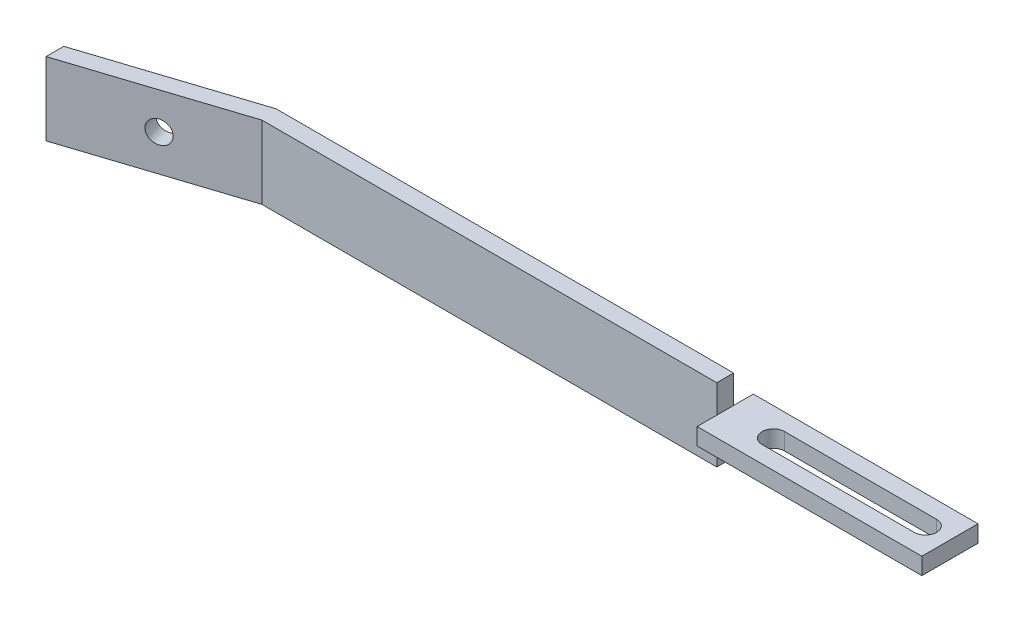
ISO-10303-21;
HEADER;
FILE_DESCRIPTION(('STEP AP214'),'2;1');
FILE_NAME('part.step','',(''),(''),'','','');
FILE_SCHEMA(('AUTOMOTIVE_DESIGN { 1 0 10303 214 1 1 1 1 }'));
ENDSEC;
DATA;
#1=APPLICATION_CONTEXT('core data for automotive mechanical design processes');
#2=APPLICATION_PROTOCOL_DEFINITION('international standard','automotive_design',2000,#1);
#3=PRODUCT_CONTEXT('',#1,'mechanical');
#4=PRODUCT('Part','Part','',(#3));
#5=PRODUCT_RELATED_PRODUCT_CATEGORY('part','',(#4));
#6=PRODUCT_DEFINITION_FORMATION('','',#4);
#7=PRODUCT_DEFINITION_CONTEXT('part definition',#1,'design');
#8=PRODUCT_DEFINITION('design','',#6,#7);
#9=PRODUCT_DEFINITION_SHAPE('','',#8);
#10=(LENGTH_UNIT() NAMED_UNIT(*) SI_UNIT(.MILLI.,.METRE.));
#11=(NAMED_UNIT(*) PLANE_ANGLE_UNIT() SI_UNIT($,.RADIAN.));
#12=(NAMED_UNIT(*) SI_UNIT($,.STERADIAN.) SOLID_ANGLE_UNIT());
#13=UNCERTAINTY_MEASURE_WITH_UNIT(LENGTH_MEASURE(1.E-05),#10,'distance_accuracy_value','');
#14=(GEOMETRIC_REPRESENTATION_CONTEXT(3) GLOBAL_UNCERTAINTY_ASSIGNED_CONTEXT((#13)) GLOBAL_UNIT_ASSIGNED_CONTEXT((#10,
#11,#12)) REPRESENTATION_CONTEXT('',''));
#15=CARTESIAN_POINT('',(0.,0.,0.));
#16=DIRECTION('',(0.,0.,1.));
#17=DIRECTION('',(1.,0.,0.));
#18=AXIS2_PLACEMENT_3D('',#15,#16,#17);
#19=CARTESIAN_POINT('',(0.,0.,0.));
#20=DIRECTION('',(0.,0.,1.));
#21=DIRECTION('',(1.,0.,0.));
#22=AXIS2_PLACEMENT_3D('',#19,#20,#21);
#23=PLANE('',#22);
#24=DIRECTION('',(0.,1.,0.));
#25=VECTOR('',#24,1.);
#26=CARTESIAN_POINT('',(34.9999999999998,-1.49999999999999,0.));
#27=LINE('',#26,#25);
#28=CARTESIAN_POINT('',(34.9999999999998,-1.49999999999999,0.));
#29=VERTEX_POINT('',#28);
#30=CARTESIAN_POINT('',(34.9999999999998,1.5,0.));
#31=VERTEX_POINT('',#30);
#32=EDGE_CURVE('E190',#29,#31,#27,.T.);
#33=ORIENTED_EDGE('',*,*,#32,.F.);
#34=DIRECTION('',(0.,-1.,0.));
#35=VECTOR('',#34,1.);
#36=CARTESIAN_POINT('',(34.9999999999998,-1.49999999999999,0.));
#37=LINE('',#36,#35);
#38=CARTESIAN_POINT('',(34.9999999999998,-6.49999999999999,0.));
#39=VERTEX_POINT('',#38);
#40=EDGE_CURVE('E212',#29,#39,#37,.T.);
#41=ORIENTED_EDGE('',*,*,#40,.T.);
#42=DIRECTION('',(1.,0.,0.));
#43=VECTOR('',#42,1.);
#44=CARTESIAN_POINT('',(-75.0000000000002,-6.49999999999999,0.));
#45=LINE('',#44,#43);
#46=CARTESIAN_POINT('',(-46.4683045111456,-6.49999999999999,0.));
#47=VERTEX_POINT('',#46);
#48=EDGE_CURVE('E278',#47,#39,#45,.T.);
#49=ORIENTED_EDGE('',*,*,#48,.F.);
#50=DIRECTION('',(0.,1.,0.));
#51=VECTOR('',#50,1.);
#52=CARTESIAN_POINT('',(-46.4683045111456,0.,0.));
#53=LINE('',#52,#51);
#54=CARTESIAN_POINT('',(-46.4683045111456,6.50000000000001,0.));
#55=VERTEX_POINT('',#54);
#56=EDGE_CURVE('E285',#47,#55,#53,.T.);
#57=ORIENTED_EDGE('',*,*,#56,.T.);
#58=DIRECTION('',(-1.,0.,0.));
#59=VECTOR('',#58,1.);
#60=CARTESIAN_POINT('',(-75.0000000000002,6.50000000000001,0.));
#61=LINE('',#60,#59);
#62=CARTESIAN_POINT('',(34.9999999999998,6.50000000000001,0.));
#63=VERTEX_POINT('',#62);
#64=EDGE_CURVE('E276',#63,#55,#61,.T.);
#65=ORIENTED_EDGE('',*,*,#64,.F.);
#66=DIRECTION('',(0.,-1.,0.));
#67=VECTOR('',#66,1.);
#68=CARTESIAN_POINT('',(34.9999999999998,1.5,0.));
#69=LINE('',#68,#67);
#70=EDGE_CURVE('E211',#63,#31,#69,.T.);
#71=ORIENTED_EDGE('',*,*,#70,.T.);
#72=EDGE_LOOP('',(#33,#41,#49,#57,#65,#71));
#73=FACE_BOUND('',#72,.T.);
#74=ADVANCED_FACE('F50',(#73),#23,.F.);
#75=CARTESIAN_POINT('',(74.9999999999998,6.50000000000001,3.));
#76=DIRECTION('',(0.,0.,-1.));
#77=DIRECTION('',(-1.,0.,0.));
#78=AXIS2_PLACEMENT_3D('',#75,#76,#77);
#79=PLANE('',#78);
#80=DIRECTION('',(1.,0.,0.));
#81=VECTOR('',#80,1.);
#82=CARTESIAN_POINT('',(74.9999999999998,-6.49999999999999,3.));
#83=LINE('',#82,#81);
#84=CARTESIAN_POINT('',(-45.993151190172,-6.49999999999999,2.99999999999999));
#85=VERTEX_POINT('',#84);
#86=CARTESIAN_POINT('',(34.9999999999998,-6.49999999999999,3.));
#87=VERTEX_POINT('',#86);
#88=EDGE_CURVE('E256',#85,#87,#83,.T.);
#89=ORIENTED_EDGE('',*,*,#88,.T.);
#90=DIRECTION('',(0.,1.,0.));
#91=VECTOR('',#90,1.);
#92=CARTESIAN_POINT('',(34.9999999999999,6.50000000000018,2.99999999999999));
#93=LINE('',#92,#91);
#94=CARTESIAN_POINT('',(34.9999999999998,-1.49999999999999,3.));
#95=VERTEX_POINT('',#94);
#96=EDGE_CURVE('E220',#87,#95,#93,.T.);
#97=ORIENTED_EDGE('',*,*,#96,.T.);
#98=DIRECTION('',(0.,-1.,0.));
#99=VECTOR('',#98,1.);
#100=CARTESIAN_POINT('',(34.9999999999998,6.50000000000001,2.99999999999999));
#101=LINE('',#100,#99);
#102=CARTESIAN_POINT('',(34.9999999999998,1.5,2.99999999999999));
#103=VERTEX_POINT('',#102);
#104=EDGE_CURVE('E288',#103,#95,#101,.T.);
#105=ORIENTED_EDGE('',*,*,#104,.F.);
#106=DIRECTION('',(0.,1.,0.));
#107=VECTOR('',#106,1.);
#108=CARTESIAN_POINT('',(34.9999999999998,6.4999999999999,2.99999999999999));
#109=LINE('',#108,#107);
#110=CARTESIAN_POINT('',(34.9999999999998,6.50000000000001,3.));
#111=VERTEX_POINT('',#110);
#112=EDGE_CURVE('E229',#103,#111,#109,.T.);
#113=ORIENTED_EDGE('',*,*,#112,.T.);
#114=DIRECTION('',(1.,0.,0.));
#115=VECTOR('',#114,1.);
#116=CARTESIAN_POINT('',(74.9999999999998,6.50000000000001,3.));
#117=LINE('',#116,#115);
#118=CARTESIAN_POINT('',(-45.993151190172,6.50000000000001,2.99999999999999));
#119=VERTEX_POINT('',#118);
#120=EDGE_CURVE('E255',#119,#111,#117,.T.);
#121=ORIENTED_EDGE('',*,*,#120,.F.);
#122=DIRECTION('',(0.,-1.,0.));
#123=VECTOR('',#122,1.);
#124=CARTESIAN_POINT('',(-45.993151190172,6.50000000000001,2.99999999999999));
#125=LINE('',#124,#123);
#126=EDGE_CURVE('E264',#119,#85,#125,.T.);
#127=ORIENTED_EDGE('',*,*,#126,.T.);
#128=EDGE_LOOP('',(#89,#97,#105,#113,#121,#127));
#129=FACE_BOUND('',#128,.T.);
#130=ADVANCED_FACE('F315',(#129),#79,.F.);
#131=CARTESIAN_POINT('',(74.9999999999998,6.50000000000001,40.));
#132=DIRECTION('',(-1.,0.,0.));
#133=DIRECTION('',(0.,-1.,0.));
#134=AXIS2_PLACEMENT_3D('',#131,#132,#133);
#135=PLANE('',#134);
#136=DIRECTION('',(0.,0.,-1.));
#137=VECTOR('',#136,1.);
#138=CARTESIAN_POINT('',(74.9999999999998,-1.49999999999999,6.5));
#139=LINE('',#138,#137);
#140=CARTESIAN_POINT('',(74.9999999999998,-1.49999999999999,6.5));
#141=VERTEX_POINT('',#140);
#142=CARTESIAN_POINT('',(74.9999999999998,-1.49999999999999,-3.5));
#143=VERTEX_POINT('',#142);
#144=EDGE_CURVE('E241',#141,#143,#139,.T.);
#145=ORIENTED_EDGE('',*,*,#144,.T.);
#146=DIRECTION('',(0.,-1.,0.));
#147=VECTOR('',#146,1.);
#148=CARTESIAN_POINT('',(74.9999999999998,-1.49999999999999,-3.5));
#149=LINE('',#148,#147);
#150=CARTESIAN_POINT('',(74.9999999999998,1.5,-3.5));
#151=VERTEX_POINT('',#150);
#152=EDGE_CURVE('E193',#151,#143,#149,.T.);
#153=ORIENTED_EDGE('',*,*,#152,.F.);
#154=DIRECTION('',(0.,0.,-1.));
#155=VECTOR('',#154,1.);
#156=CARTESIAN_POINT('',(74.9999999999998,1.50000000000001,6.5));
#157=LINE('',#156,#155);
#158=CARTESIAN_POINT('',(74.9999999999998,1.50000000000001,6.5));
#159=VERTEX_POINT('',#158);
#160=EDGE_CURVE('E249',#159,#151,#157,.T.);
#161=ORIENTED_EDGE('',*,*,#160,.F.);
#162=DIRECTION('',(0.,1.,0.));
#163=VECTOR('',#162,1.);
#164=CARTESIAN_POINT('',(74.9999999999998,1.50000000000001,6.5));
#165=LINE('',#164,#163);
#166=EDGE_CURVE('E232',#141,#159,#165,.T.);
#167=ORIENTED_EDGE('',*,*,#166,.F.);
#168=EDGE_LOOP('',(#145,#153,#161,#167));
#169=FACE_BOUND('',#168,.T.);
#170=ADVANCED_FACE('F52',(#169),#135,.F.);
#171=CARTESIAN_POINT('',(-75.0000000000002,6.50000000000001,40.));
#172=DIRECTION('',(0.,-1.,0.));
#173=DIRECTION('',(0.,0.,-1.));
#174=AXIS2_PLACEMENT_3D('',#171,#172,#173);
#175=PLANE('',#174);
#176=ORIENTED_EDGE('',*,*,#120,.T.);
#177=DIRECTION('',(0.,0.,1.));
#178=VECTOR('',#177,1.);
#179=CARTESIAN_POINT('',(34.9999999999998,6.50000000000001,0.));
#180=LINE('',#179,#178);
#181=EDGE_CURVE('E223',#63,#111,#180,.T.);
#182=ORIENTED_EDGE('',*,*,#181,.F.);
#183=ORIENTED_EDGE('',*,*,#64,.T.);
#184=DIRECTION('',(-0.951056516295153,0.,0.309016994374949));
#185=VECTOR('',#184,1.);
#186=CARTESIAN_POINT('',(-84.0311705658295,6.50000000000001,12.2049150281253));
#187=LINE('',#186,#185);
#188=CARTESIAN_POINT('',(-75.0000000000002,6.50000000000001,9.27050983124846));
#189=VERTEX_POINT('',#188);
#190=EDGE_CURVE('E273',#55,#189,#187,.T.);
#191=ORIENTED_EDGE('',*,*,#190,.T.);
#192=DIRECTION('',(0.,0.,-1.));
#193=VECTOR('',#192,1.);
#194=CARTESIAN_POINT('',(-75.0000000000002,6.50000000000001,40.));
#195=LINE('',#194,#193);
#196=CARTESIAN_POINT('',(-75.0000000000002,6.50000000000001,12.4248965039633));
#197=VERTEX_POINT('',#196);
#198=EDGE_CURVE('E283',#197,#189,#195,.T.);
#199=ORIENTED_EDGE('',*,*,#198,.F.);
#200=DIRECTION('',(0.951056516295153,0.,-0.309016994374949));
#201=VECTOR('',#200,1.);
#202=CARTESIAN_POINT('',(-75.0000000000002,6.50000000000001,12.4248965039633));
#203=LINE('',#202,#201);
#204=EDGE_CURVE('E252',#197,#119,#203,.T.);
#205=ORIENTED_EDGE('',*,*,#204,.T.);
#206=EDGE_LOOP('',(#176,#182,#183,#191,#199,#205));
#207=FACE_BOUND('',#206,.T.);
#208=ADVANCED_FACE('F333',(#207),#175,.F.);
#209=CARTESIAN_POINT('',(-75.0000000000002,6.50000000000001,40.));
#210=DIRECTION('',(1.,0.,0.));
#211=DIRECTION('',(0.,1.,0.));
#212=AXIS2_PLACEMENT_3D('',#209,#210,#211);
#213=PLANE('',#212);
#214=DIRECTION('',(0.,0.,-1.));
#215=VECTOR('',#214,1.);
#216=CARTESIAN_POINT('',(-75.0000000000002,-6.49999999999999,40.));
#217=LINE('',#216,#215);
#218=CARTESIAN_POINT('',(-75.0000000000002,-6.49999999999999,12.4248965039633));
#219=VERTEX_POINT('',#218);
#220=CARTESIAN_POINT('',(-75.0000000000002,-6.49999999999999,9.27050983124846));
#221=VERTEX_POINT('',#220);
#222=EDGE_CURVE('E281',#219,#221,#217,.T.);
#223=ORIENTED_EDGE('',*,*,#222,.F.);
#224=DIRECTION('',(0.,-1.,0.));
#225=VECTOR('',#224,1.);
#226=CARTESIAN_POINT('',(-75.0000000000002,6.50000000000001,12.4248965039633));
#227=LINE('',#226,#225);
#228=EDGE_CURVE('E259',#197,#219,#227,.T.);
#229=ORIENTED_EDGE('',*,*,#228,.F.);
#230=ORIENTED_EDGE('',*,*,#198,.T.);
#231=DIRECTION('',(0.,-1.,0.));
#232=VECTOR('',#231,1.);
#233=CARTESIAN_POINT('',(-75.0000000000002,33.5,9.27050983124846));
#234=LINE('',#233,#232);
#235=EDGE_CURVE('E270',#189,#221,#234,.T.);
#236=ORIENTED_EDGE('',*,*,#235,.T.);
#237=EDGE_LOOP('',(#223,#229,#230,#236));
#238=FACE_BOUND('',#237,.T.);
#239=ADVANCED_FACE('F330',(#238),#213,.F.);
#240=CARTESIAN_POINT('',(-75.0000000000002,-6.49999999999999,40.));
#241=DIRECTION('',(0.,1.,0.));
#242=DIRECTION('',(0.,0.,1.));
#243=AXIS2_PLACEMENT_3D('',#240,#241,#242);
#244=PLANE('',#243);
#245=ORIENTED_EDGE('',*,*,#48,.T.);
#246=DIRECTION('',(0.,0.,1.));
#247=VECTOR('',#246,1.);
#248=CARTESIAN_POINT('',(34.9999999999998,-6.49999999999999,0.));
#249=LINE('',#248,#247);
#250=EDGE_CURVE('E217',#39,#87,#249,.T.);
#251=ORIENTED_EDGE('',*,*,#250,.T.);
#252=ORIENTED_EDGE('',*,*,#88,.F.);
#253=DIRECTION('',(0.951056516295153,0.,-0.309016994374949));
#254=VECTOR('',#253,1.);
#255=CARTESIAN_POINT('',(-75.0000000000002,-6.49999999999999,12.4248965039633));
#256=LINE('',#255,#254);
#257=EDGE_CURVE('E251',#219,#85,#256,.T.);
#258=ORIENTED_EDGE('',*,*,#257,.F.);
#259=ORIENTED_EDGE('',*,*,#222,.T.);
#260=DIRECTION('',(-0.951056516295153,0.,0.309016994374949));
#261=VECTOR('',#260,1.);
#262=CARTESIAN_POINT('',(-75.0000000000002,-6.49999999999999,9.27050983124846));
#263=LINE('',#262,#261);
#264=EDGE_CURVE('E266',#47,#221,#263,.T.);
#265=ORIENTED_EDGE('',*,*,#264,.F.);
#266=EDGE_LOOP('',(#245,#251,#252,#258,#259,#265));
#267=FACE_BOUND('',#266,.T.);
#268=ADVANCED_FACE('F327',(#267),#244,.F.);
#269=CARTESIAN_POINT('',(-75.0000000000002,33.5,9.27050983124846));
#270=DIRECTION('',(0.309016994374949,0.,0.951056516295153));
#271=DIRECTION('',(0.951056516295153,0.,-0.309016994374949));
#272=AXIS2_PLACEMENT_3D('',#269,#270,#271);
#273=PLANE('',#272);
#274=CARTESIAN_POINT('',(-60.7341522555729,0.,4.63525491562423));
#275=DIRECTION('',(-0.309016994374949,0.,-0.951056516295153));
#276=DIRECTION('',(-0.951056516295153,0.,0.309016994374949));
#277=AXIS2_PLACEMENT_3D('',#274,#275,#276);
#278=CIRCLE('',#277,1.99999999999999);
#279=CARTESIAN_POINT('',(-62.6362652881632,0.,5.25328890437412));
#280=VERTEX_POINT('',#279);
#281=EDGE_CURVE('E404',#280,#280,#278,.T.);
#282=ORIENTED_EDGE('',*,*,#281,.F.);
#283=EDGE_LOOP('',(#282));
#284=FACE_BOUND('',#283,.T.);
#285=ORIENTED_EDGE('',*,*,#56,.F.);
#286=ORIENTED_EDGE('',*,*,#264,.T.);
#287=ORIENTED_EDGE('',*,*,#235,.F.);
#288=ORIENTED_EDGE('',*,*,#190,.F.);
#289=EDGE_LOOP('',(#285,#286,#287,#288));
#290=FACE_BOUND('',#289,.T.);
#291=ADVANCED_FACE('F325',(#284,#290),#273,.F.);
#292=CARTESIAN_POINT('',(-75.0000000000002,6.50000000000001,12.4248965039633));
#293=DIRECTION('',(-0.309016994374949,0.,-0.951056516295153));
#294=DIRECTION('',(-0.951056516295153,0.,0.309016994374949));
#295=AXIS2_PLACEMENT_3D('',#292,#293,#294);
#296=PLANE('',#295);
#297=CARTESIAN_POINT('',(-59.807101272448,0.,7.48842446450968));
#298=DIRECTION('',(-0.309016994374949,0.,-0.951056516295153));
#299=DIRECTION('',(-0.951056516295153,0.,0.309016994374949));
#300=AXIS2_PLACEMENT_3D('',#297,#298,#299);
#301=CIRCLE('',#300,1.99999999999999);
#302=CARTESIAN_POINT('',(-61.7092143050383,0.,8.10645845325958));
#303=VERTEX_POINT('',#302);
#304=EDGE_CURVE('E54',#303,#303,#301,.T.);
#305=ORIENTED_EDGE('',*,*,#304,.T.);
#306=EDGE_LOOP('',(#305));
#307=FACE_BOUND('',#306,.T.);
#308=ORIENTED_EDGE('',*,*,#257,.T.);
#309=ORIENTED_EDGE('',*,*,#126,.F.);
#310=ORIENTED_EDGE('',*,*,#204,.F.);
#311=ORIENTED_EDGE('',*,*,#228,.T.);
#312=EDGE_LOOP('',(#308,#309,#310,#311));
#313=FACE_BOUND('',#312,.T.);
#314=ADVANCED_FACE('F388',(#307,#313),#296,.F.);
#315=CARTESIAN_POINT('',(74.9999999999998,1.50000000000001,6.5));
#316=DIRECTION('',(0.,-1.,0.));
#317=DIRECTION('',(1.,0.,0.));
#318=AXIS2_PLACEMENT_3D('',#315,#316,#317);
#319=PLANE('',#318);
#320=DIRECTION('',(-1.,0.,0.));
#321=VECTOR('',#320,1.);
#322=CARTESIAN_POINT('',(70.6386916232802,1.50000000000001,-0.5));
#323=LINE('',#322,#321);
#324=CARTESIAN_POINT('',(70.6386916232802,1.50000000000001,-0.5));
#325=VERTEX_POINT('',#324);
#326=CARTESIAN_POINT('',(43.5615097736033,1.5,-0.499999999999997));
#327=VERTEX_POINT('',#326);
#328=EDGE_CURVE('E176',#325,#327,#323,.T.);
#329=ORIENTED_EDGE('',*,*,#328,.F.);
#330=CARTESIAN_POINT('',(70.6386916232802,1.50000000000001,1.5));
#331=DIRECTION('',(0.,1.,0.));
#332=DIRECTION('',(-1.,0.,0.));
#333=AXIS2_PLACEMENT_3D('',#330,#331,#332);
#334=CIRCLE('',#333,2.);
#335=CARTESIAN_POINT('',(70.6386916232802,1.50000000000001,3.5));
#336=VERTEX_POINT('',#335);
#337=EDGE_CURVE('E66',#336,#325,#334,.T.);
#338=ORIENTED_EDGE('',*,*,#337,.F.);
#339=DIRECTION('',(1.,0.,0.));
#340=VECTOR('',#339,1.);
#341=CARTESIAN_POINT('',(70.6386916232802,1.50000000000001,3.5));
#342=LINE('',#341,#340);
#343=CARTESIAN_POINT('',(43.5615097736033,1.5,3.5));
#344=VERTEX_POINT('',#343);
#345=EDGE_CURVE('E183',#344,#336,#342,.T.);
#346=ORIENTED_EDGE('',*,*,#345,.F.);
#347=CARTESIAN_POINT('',(43.5615097736033,1.5,1.5));
#348=DIRECTION('',(0.,1.,0.));
#349=DIRECTION('',(-1.,0.,0.));
#350=AXIS2_PLACEMENT_3D('',#347,#348,#349);
#351=CIRCLE('',#350,2.);
#352=EDGE_CURVE('E167',#327,#344,#351,.T.);
#353=ORIENTED_EDGE('',*,*,#352,.F.);
#354=EDGE_LOOP('',(#329,#338,#346,#353));
#355=FACE_BOUND('',#354,.T.);
#356=ORIENTED_EDGE('',*,*,#160,.T.);
#357=DIRECTION('',(1.,0.,0.));
#358=VECTOR('',#357,1.);
#359=CARTESIAN_POINT('',(74.9999999999998,1.5,-3.5));
#360=LINE('',#359,#358);
#361=CARTESIAN_POINT('',(34.9999999999998,1.5,-3.5));
#362=VERTEX_POINT('',#361);
#363=EDGE_CURVE('E200',#362,#151,#360,.T.);
#364=ORIENTED_EDGE('',*,*,#363,.F.);
#365=DIRECTION('',(0.,0.,1.));
#366=VECTOR('',#365,1.);
#367=CARTESIAN_POINT('',(34.9999999999998,1.5,-3.5));
#368=LINE('',#367,#366);
#369=EDGE_CURVE('E203',#362,#31,#368,.T.);
#370=ORIENTED_EDGE('',*,*,#369,.T.);
#371=DIRECTION('',(0.,0.,1.));
#372=VECTOR('',#371,1.);
#373=CARTESIAN_POINT('',(34.9999999999998,1.5,0.));
#374=LINE('',#373,#372);
#375=EDGE_CURVE('E216',#31,#103,#374,.T.);
#376=ORIENTED_EDGE('',*,*,#375,.T.);
#377=DIRECTION('',(0.,0.,-1.));
#378=VECTOR('',#377,1.);
#379=CARTESIAN_POINT('',(34.9999999999998,1.5,6.5));
#380=LINE('',#379,#378);
#381=CARTESIAN_POINT('',(34.9999999999998,1.5,6.5));
#382=VERTEX_POINT('',#381);
#383=EDGE_CURVE('E246',#382,#103,#380,.T.);
#384=ORIENTED_EDGE('',*,*,#383,.F.);
#385=DIRECTION('',(-1.,0.,0.));
#386=VECTOR('',#385,1.);
#387=CARTESIAN_POINT('',(74.9999999999998,1.50000000000001,6.5));
#388=LINE('',#387,#386);
#389=EDGE_CURVE('E235',#159,#382,#388,.T.);
#390=ORIENTED_EDGE('',*,*,#389,.F.);
#391=EDGE_LOOP('',(#356,#364,#370,#376,#384,#390));
#392=FACE_BOUND('',#391,.T.);
#393=ADVANCED_FACE('F180',(#355,#392),#319,.F.);
#394=CARTESIAN_POINT('',(34.9999999999998,1.5,6.5));
#395=DIRECTION('',(1.,0.,0.));
#396=DIRECTION('',(0.,0.,-1.));
#397=AXIS2_PLACEMENT_3D('',#394,#395,#396);
#398=PLANE('',#397);
#399=ORIENTED_EDGE('',*,*,#383,.T.);
#400=ORIENTED_EDGE('',*,*,#104,.T.);
#401=DIRECTION('',(0.,0.,-1.));
#402=VECTOR('',#401,1.);
#403=CARTESIAN_POINT('',(34.9999999999998,-1.5,6.5));
#404=LINE('',#403,#402);
#405=CARTESIAN_POINT('',(34.9999999999998,-1.5,6.5));
#406=VERTEX_POINT('',#405);
#407=EDGE_CURVE('E243',#406,#95,#404,.T.);
#408=ORIENTED_EDGE('',*,*,#407,.F.);
#409=DIRECTION('',(0.,-1.,0.));
#410=VECTOR('',#409,1.);
#411=CARTESIAN_POINT('',(34.9999999999998,1.5,6.5));
#412=LINE('',#411,#410);
#413=EDGE_CURVE('E237',#382,#406,#412,.T.);
#414=ORIENTED_EDGE('',*,*,#413,.F.);
#415=EDGE_LOOP('',(#399,#400,#408,#414));
#416=FACE_BOUND('',#415,.T.);
#417=ADVANCED_FACE('F368',(#416),#398,.F.);
#418=CARTESIAN_POINT('',(74.9999999999998,-1.49999999999999,6.5));
#419=DIRECTION('',(0.,1.,0.));
#420=DIRECTION('',(-1.,0.,0.));
#421=AXIS2_PLACEMENT_3D('',#418,#419,#420);
#422=PLANE('',#421);
#423=DIRECTION('',(1.,0.,0.));
#424=VECTOR('',#423,1.);
#425=CARTESIAN_POINT('',(74.9999999999998,-1.49999999999999,3.5));
#426=LINE('',#425,#424);
#427=CARTESIAN_POINT('',(43.5615097736033,-1.5,3.5));
#428=VERTEX_POINT('',#427);
#429=CARTESIAN_POINT('',(70.6386916232802,-1.49999999999999,3.5));
#430=VERTEX_POINT('',#429);
#431=EDGE_CURVE('E59',#428,#430,#426,.T.);
#432=ORIENTED_EDGE('',*,*,#431,.T.);
#433=CARTESIAN_POINT('',(70.6386916232802,-1.49999999999999,1.5));
#434=DIRECTION('',(0.,1.,0.));
#435=DIRECTION('',(-1.,0.,0.));
#436=AXIS2_PLACEMENT_3D('',#433,#434,#435);
#437=CIRCLE('',#436,2.);
#438=CARTESIAN_POINT('',(70.6386916232802,-1.49999999999999,-0.5));
#439=VERTEX_POINT('',#438);
#440=EDGE_CURVE('E13',#430,#439,#437,.T.);
#441=ORIENTED_EDGE('',*,*,#440,.T.);
#442=DIRECTION('',(-1.,0.,0.));
#443=VECTOR('',#442,1.);
#444=CARTESIAN_POINT('',(74.9999999999998,-1.49999999999999,-0.5));
#445=LINE('',#444,#443);
#446=CARTESIAN_POINT('',(43.5615097736033,-1.49999999999999,-0.499999999999997));
#447=VERTEX_POINT('',#446);
#448=EDGE_CURVE('E291',#439,#447,#445,.T.);
#449=ORIENTED_EDGE('',*,*,#448,.T.);
#450=CARTESIAN_POINT('',(43.5615097736033,-1.49999999999999,1.5));
#451=DIRECTION('',(0.,1.,0.));
#452=DIRECTION('',(-1.,0.,0.));
#453=AXIS2_PLACEMENT_3D('',#450,#451,#452);
#454=CIRCLE('',#453,2.);
#455=EDGE_CURVE('E170',#447,#428,#454,.T.);
#456=ORIENTED_EDGE('',*,*,#455,.T.);
#457=EDGE_LOOP('',(#432,#441,#449,#456));
#458=FACE_BOUND('',#457,.T.);
#459=ORIENTED_EDGE('',*,*,#407,.T.);
#460=DIRECTION('',(0.,0.,1.));
#461=VECTOR('',#460,1.);
#462=CARTESIAN_POINT('',(34.9999999999998,-1.49999999999999,0.));
#463=LINE('',#462,#461);
#464=EDGE_CURVE('E215',#29,#95,#463,.T.);
#465=ORIENTED_EDGE('',*,*,#464,.F.);
#466=DIRECTION('',(0.,0.,1.));
#467=VECTOR('',#466,1.);
#468=CARTESIAN_POINT('',(34.9999999999998,-1.49999999999999,-3.5));
#469=LINE('',#468,#467);
#470=CARTESIAN_POINT('',(34.9999999999998,-1.49999999999999,-3.5));
#471=VERTEX_POINT('',#470);
#472=EDGE_CURVE('E208',#471,#29,#469,.T.);
#473=ORIENTED_EDGE('',*,*,#472,.F.);
#474=DIRECTION('',(-1.,0.,0.));
#475=VECTOR('',#474,1.);
#476=CARTESIAN_POINT('',(74.9999999999998,-1.49999999999999,-3.5));
#477=LINE('',#476,#475);
#478=EDGE_CURVE('E196',#143,#471,#477,.T.);
#479=ORIENTED_EDGE('',*,*,#478,.F.);
#480=ORIENTED_EDGE('',*,*,#144,.F.);
#481=DIRECTION('',(1.,0.,0.));
#482=VECTOR('',#481,1.);
#483=CARTESIAN_POINT('',(74.9999999999998,-1.49999999999999,6.5));
#484=LINE('',#483,#482);
#485=EDGE_CURVE('E239',#406,#141,#484,.T.);
#486=ORIENTED_EDGE('',*,*,#485,.F.);
#487=EDGE_LOOP('',(#459,#465,#473,#479,#480,#486));
#488=FACE_BOUND('',#487,.T.);
#489=ADVANCED_FACE('F296',(#458,#488),#422,.F.);
#490=CARTESIAN_POINT('',(0.,0.,6.5));
#491=DIRECTION('',(0.,0.,-1.));
#492=DIRECTION('',(-1.,0.,0.));
#493=AXIS2_PLACEMENT_3D('',#490,#491,#492);
#494=PLANE('',#493);
#495=ORIENTED_EDGE('',*,*,#166,.T.);
#496=ORIENTED_EDGE('',*,*,#389,.T.);
#497=ORIENTED_EDGE('',*,*,#413,.T.);
#498=ORIENTED_EDGE('',*,*,#485,.T.);
#499=EDGE_LOOP('',(#495,#496,#497,#498));
#500=FACE_BOUND('',#499,.T.);
#501=ADVANCED_FACE('F370',(#500),#494,.F.);
#502=CARTESIAN_POINT('',(34.9999999999998,1.5,0.));
#503=DIRECTION('',(-1.,0.,0.));
#504=DIRECTION('',(0.,-1.,0.));
#505=AXIS2_PLACEMENT_3D('',#502,#503,#504);
#506=PLANE('',#505);
#507=ORIENTED_EDGE('',*,*,#375,.F.);
#508=ORIENTED_EDGE('',*,*,#70,.F.);
#509=ORIENTED_EDGE('',*,*,#181,.T.);
#510=ORIENTED_EDGE('',*,*,#112,.F.);
#511=EDGE_LOOP('',(#507,#508,#509,#510));
#512=FACE_BOUND('',#511,.T.);
#513=ADVANCED_FACE('F348',(#512),#506,.F.);
#514=CARTESIAN_POINT('',(34.9999999999998,-1.49999999999999,0.));
#515=DIRECTION('',(-1.,0.,0.));
#516=DIRECTION('',(0.,-1.,0.));
#517=AXIS2_PLACEMENT_3D('',#514,#515,#516);
#518=PLANE('',#517);
#519=ORIENTED_EDGE('',*,*,#250,.F.);
#520=ORIENTED_EDGE('',*,*,#40,.F.);
#521=ORIENTED_EDGE('',*,*,#464,.T.);
#522=ORIENTED_EDGE('',*,*,#96,.F.);
#523=EDGE_LOOP('',(#519,#520,#521,#522));
#524=FACE_BOUND('',#523,.T.);
#525=ADVANCED_FACE('F363',(#524),#518,.F.);
#526=CARTESIAN_POINT('',(34.9999999999998,-1.49999999999999,-3.5));
#527=DIRECTION('',(1.,0.,0.));
#528=DIRECTION('',(0.,0.,-1.));
#529=AXIS2_PLACEMENT_3D('',#526,#527,#528);
#530=PLANE('',#529);
#531=ORIENTED_EDGE('',*,*,#32,.T.);
#532=ORIENTED_EDGE('',*,*,#369,.F.);
#533=DIRECTION('',(0.,1.,0.));
#534=VECTOR('',#533,1.);
#535=CARTESIAN_POINT('',(34.9999999999998,-1.49999999999999,-3.5));
#536=LINE('',#535,#534);
#537=EDGE_CURVE('E198',#471,#362,#536,.T.);
#538=ORIENTED_EDGE('',*,*,#537,.F.);
#539=ORIENTED_EDGE('',*,*,#472,.T.);
#540=EDGE_LOOP('',(#531,#532,#538,#539));
#541=FACE_BOUND('',#540,.T.);
#542=ADVANCED_FACE('F310',(#541),#530,.F.);
#543=CARTESIAN_POINT('',(0.,0.,-3.5));
#544=DIRECTION('',(0.,0.,1.));
#545=DIRECTION('',(1.,0.,0.));
#546=AXIS2_PLACEMENT_3D('',#543,#544,#545);
#547=PLANE('',#546);
#548=ORIENTED_EDGE('',*,*,#152,.T.);
#549=ORIENTED_EDGE('',*,*,#478,.T.);
#550=ORIENTED_EDGE('',*,*,#537,.T.);
#551=ORIENTED_EDGE('',*,*,#363,.T.);
#552=EDGE_LOOP('',(#548,#549,#550,#551));
#553=FACE_BOUND('',#552,.T.);
#554=ADVANCED_FACE('F303',(#553),#547,.F.);
#555=CARTESIAN_POINT('',(70.6386916232802,-4.99999999999999,1.5));
#556=DIRECTION('',(0.,1.,0.));
#557=DIRECTION('',(-1.,0.,0.));
#558=AXIS2_PLACEMENT_3D('',#555,#556,#557);
#559=CYLINDRICAL_SURFACE('',#558,2.);
#560=DIRECTION('',(0.,1.,0.));
#561=VECTOR('',#560,1.);
#562=CARTESIAN_POINT('',(70.6386916232802,-4.99999999999999,3.5));
#563=LINE('',#562,#561);
#564=EDGE_CURVE('E188',#430,#336,#563,.T.);
#565=ORIENTED_EDGE('',*,*,#564,.T.);
#566=ORIENTED_EDGE('',*,*,#337,.T.);
#567=DIRECTION('',(0.,1.,0.));
#568=VECTOR('',#567,1.);
#569=CARTESIAN_POINT('',(70.6386916232802,-4.99999999999999,-0.5));
#570=LINE('',#569,#568);
#571=EDGE_CURVE('E173',#439,#325,#570,.T.);
#572=ORIENTED_EDGE('',*,*,#571,.F.);
#573=ORIENTED_EDGE('',*,*,#440,.F.);
#574=EDGE_LOOP('',(#565,#566,#572,#573));
#575=FACE_BOUND('',#574,.T.);
#576=ADVANCED_FACE('F301',(#575),#559,.F.);
#577=CARTESIAN_POINT('',(70.6386916232802,-4.99999999999999,3.5));
#578=DIRECTION('',(0.,0.,1.));
#579=DIRECTION('',(1.,0.,0.));
#580=AXIS2_PLACEMENT_3D('',#577,#578,#579);
#581=PLANE('',#580);
#582=DIRECTION('',(0.,1.,0.));
#583=VECTOR('',#582,1.);
#584=CARTESIAN_POINT('',(43.5615097736033,-5.,3.5));
#585=LINE('',#584,#583);
#586=EDGE_CURVE('E172',#428,#344,#585,.T.);
#587=ORIENTED_EDGE('',*,*,#586,.T.);
#588=ORIENTED_EDGE('',*,*,#345,.T.);
#589=ORIENTED_EDGE('',*,*,#564,.F.);
#590=ORIENTED_EDGE('',*,*,#431,.F.);
#591=EDGE_LOOP('',(#587,#588,#589,#590));
#592=FACE_BOUND('',#591,.T.);
#593=ADVANCED_FACE('F300',(#592),#581,.F.);
#594=CARTESIAN_POINT('',(43.5615097736033,-5.,1.5));
#595=DIRECTION('',(0.,1.,0.));
#596=DIRECTION('',(-1.,0.,0.));
#597=AXIS2_PLACEMENT_3D('',#594,#595,#596);
#598=CYLINDRICAL_SURFACE('',#597,2.);
#599=DIRECTION('',(0.,1.,0.));
#600=VECTOR('',#599,1.);
#601=CARTESIAN_POINT('',(43.5615097736033,-5.,-0.499999999999997));
#602=LINE('',#601,#600);
#603=EDGE_CURVE('E74',#447,#327,#602,.T.);
#604=ORIENTED_EDGE('',*,*,#603,.T.);
#605=ORIENTED_EDGE('',*,*,#352,.T.);
#606=ORIENTED_EDGE('',*,*,#586,.F.);
#607=ORIENTED_EDGE('',*,*,#455,.F.);
#608=EDGE_LOOP('',(#604,#605,#606,#607));
#609=FACE_BOUND('',#608,.T.);
#610=ADVANCED_FACE('F164',(#609),#598,.F.);
#611=CARTESIAN_POINT('',(70.6386916232802,-4.99999999999999,-0.5));
#612=DIRECTION('',(0.,0.,-1.));
#613=DIRECTION('',(-1.,0.,0.));
#614=AXIS2_PLACEMENT_3D('',#611,#612,#613);
#615=PLANE('',#614);
#616=ORIENTED_EDGE('',*,*,#571,.T.);
#617=ORIENTED_EDGE('',*,*,#328,.T.);
#618=ORIENTED_EDGE('',*,*,#603,.F.);
#619=ORIENTED_EDGE('',*,*,#448,.F.);
#620=EDGE_LOOP('',(#616,#617,#618,#619));
#621=FACE_BOUND('',#620,.T.);
#622=ADVANCED_FACE('F177',(#621),#615,.F.);
#623=CARTESIAN_POINT('',(-58.7255417921357,0.,10.8171222715427));
#624=DIRECTION('',(-0.309016994374949,0.,-0.951056516295153));
#625=DIRECTION('',(-0.951056516295153,0.,0.309016994374949));
#626=AXIS2_PLACEMENT_3D('',#623,#624,#625);
#627=CYLINDRICAL_SURFACE('',#626,1.99999999999999);
#628=ORIENTED_EDGE('',*,*,#281,.T.);
#629=EDGE_LOOP('',(#628));
#630=FACE_BOUND('',#629,.T.);
#631=ORIENTED_EDGE('',*,*,#304,.F.);
#632=EDGE_LOOP('',(#631));
#633=FACE_BOUND('',#632,.T.);
#634=ADVANCED_FACE('F409',(#630,#633),#627,.F.);
#635=CLOSED_SHELL('',(#74,#130,#170,#208,#239,#268,#291,#314,#393,#417,#489,#501,#513,#525,#542,
#554,#576,#593,#610,#622,#634));
#636=MANIFOLD_SOLID_BREP('B2',#635);
#637=ADVANCED_BREP_SHAPE_REPRESENTATION('',(#18,#636),#14);
#638=SHAPE_DEFINITION_REPRESENTATION(#9,#637);
ENDSEC;
END-ISO-10303-21;
